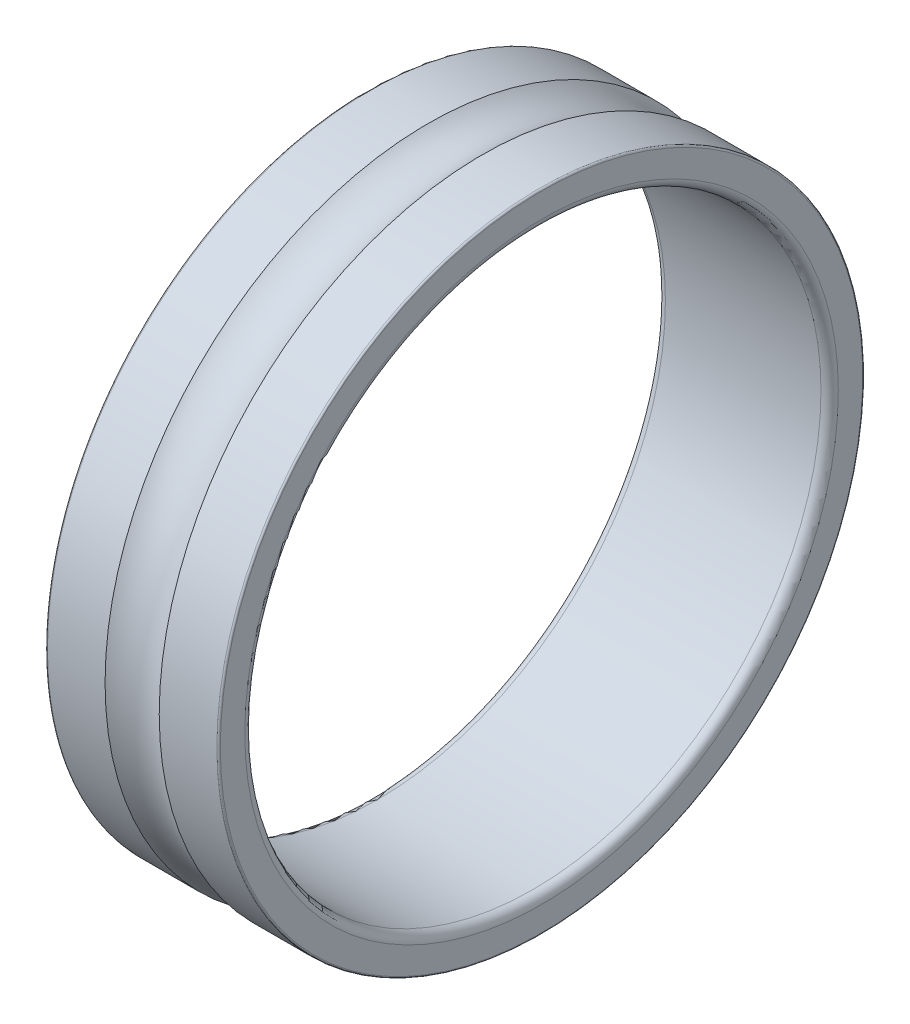
ISO-10303-21;
HEADER;
FILE_DESCRIPTION(('STEP AP214'),'2;1');
FILE_NAME('part.step','',(''),(''),'','','');
FILE_SCHEMA(('AUTOMOTIVE_DESIGN { 1 0 10303 214 1 1 1 1 }'));
ENDSEC;
DATA;
#1=APPLICATION_CONTEXT('core data for automotive mechanical design processes');
#2=APPLICATION_PROTOCOL_DEFINITION('international standard','automotive_design',2000,#1);
#3=PRODUCT_CONTEXT('',#1,'mechanical');
#4=PRODUCT('Part','Part','',(#3));
#5=PRODUCT_RELATED_PRODUCT_CATEGORY('part','',(#4));
#6=PRODUCT_DEFINITION_FORMATION('','',#4);
#7=PRODUCT_DEFINITION_CONTEXT('part definition',#1,'design');
#8=PRODUCT_DEFINITION('design','',#6,#7);
#9=PRODUCT_DEFINITION_SHAPE('','',#8);
#10=(LENGTH_UNIT() NAMED_UNIT(*) SI_UNIT(.MILLI.,.METRE.));
#11=(NAMED_UNIT(*) PLANE_ANGLE_UNIT() SI_UNIT($,.RADIAN.));
#12=(NAMED_UNIT(*) SI_UNIT($,.STERADIAN.) SOLID_ANGLE_UNIT());
#13=UNCERTAINTY_MEASURE_WITH_UNIT(LENGTH_MEASURE(1.E-05),#10,'distance_accuracy_value','');
#14=(GEOMETRIC_REPRESENTATION_CONTEXT(3) GLOBAL_UNCERTAINTY_ASSIGNED_CONTEXT((#13)) GLOBAL_UNIT_ASSIGNED_CONTEXT((#10,
#11,#12)) REPRESENTATION_CONTEXT('',''));
#15=CARTESIAN_POINT('',(0.,0.,0.));
#16=DIRECTION('',(0.,0.,1.));
#17=DIRECTION('',(1.,0.,0.));
#18=AXIS2_PLACEMENT_3D('',#15,#16,#17);
#19=CARTESIAN_POINT('',(0.,-5.575,-5.575));
#20=DIRECTION('',(-1.,0.,0.));
#21=DIRECTION('',(0.,0.,1.));
#22=AXIS2_PLACEMENT_3D('',#19,#20,#21);
#23=PLANE('',#22);
#24=CARTESIAN_POINT('',(0.,0.,0.));
#25=DIRECTION('',(-1.,0.,0.));
#26=DIRECTION('',(0.,0.,-1.));
#27=AXIS2_PLACEMENT_3D('',#24,#25,#26);
#28=CIRCLE('',#27,5.575);
#29=CARTESIAN_POINT('',(0.,0.,-5.575));
#30=VERTEX_POINT('',#29);
#31=EDGE_CURVE('E50',#30,#30,#28,.F.);
#32=ORIENTED_EDGE('',*,*,#31,.F.);
#33=EDGE_LOOP('',(#32));
#34=FACE_BOUND('',#33,.T.);
#35=CARTESIAN_POINT('',(0.,0.,0.));
#36=DIRECTION('',(1.,0.,0.));
#37=DIRECTION('',(0.,-1.4250476733921E-07,0.99999999999999));
#38=AXIS2_PLACEMENT_3D('',#35,#36,#37);
#39=CIRCLE('',#38,5.15);
#40=CARTESIAN_POINT('',(0.,-7.33899551796931E-07,5.14999999999995));
#41=VERTEX_POINT('',#40);
#42=EDGE_CURVE('E47',#41,#41,#39,.T.);
#43=ORIENTED_EDGE('',*,*,#42,.T.);
#44=EDGE_LOOP('',(#43));
#45=FACE_BOUND('',#44,.T.);
#46=ADVANCED_FACE('F15',(#34,#45),#23,.T.);
#47=CARTESIAN_POINT('',(3.,-5.575,5.575));
#48=DIRECTION('',(1.,0.,0.));
#49=DIRECTION('',(0.,0.,-1.));
#50=AXIS2_PLACEMENT_3D('',#47,#48,#49);
#51=PLANE('',#50);
#52=CARTESIAN_POINT('',(3.,0.,0.));
#53=DIRECTION('',(1.,0.,0.));
#54=DIRECTION('',(0.,0.,1.));
#55=AXIS2_PLACEMENT_3D('',#52,#53,#54);
#56=CIRCLE('',#55,5.575);
#57=CARTESIAN_POINT('',(3.,0.,5.575));
#58=VERTEX_POINT('',#57);
#59=EDGE_CURVE('E44',#58,#58,#56,.T.);
#60=ORIENTED_EDGE('',*,*,#59,.T.);
#61=EDGE_LOOP('',(#60));
#62=FACE_BOUND('',#61,.T.);
#63=CARTESIAN_POINT('',(3.,0.,0.));
#64=DIRECTION('',(-1.,0.,0.));
#65=DIRECTION('',(0.,0.,-1.));
#66=AXIS2_PLACEMENT_3D('',#63,#64,#65);
#67=CIRCLE('',#66,5.15);
#68=CARTESIAN_POINT('',(3.,0.,-5.15));
#69=VERTEX_POINT('',#68);
#70=EDGE_CURVE('E41',#69,#69,#67,.F.);
#71=ORIENTED_EDGE('',*,*,#70,.F.);
#72=EDGE_LOOP('',(#71));
#73=FACE_BOUND('',#72,.T.);
#74=ADVANCED_FACE('F59',(#62,#73),#51,.T.);
#75=CARTESIAN_POINT('',(0.0299999999999943,0.,0.));
#76=DIRECTION('',(1.,0.,0.));
#77=DIRECTION('',(0.,1.16860045008147E-09,1.));
#78=AXIS2_PLACEMENT_3D('',#75,#76,#77);
#79=TOROIDAL_SURFACE('',#78,5.575,0.0299999999999936);
#80=ORIENTED_EDGE('',*,*,#31,.T.);
#81=EDGE_LOOP('',(#80));
#82=FACE_BOUND('',#81,.T.);
#83=CARTESIAN_POINT('',(0.0299999999999942,0.,0.));
#84=DIRECTION('',(-1.,0.,0.));
#85=DIRECTION('',(0.,0.,-1.));
#86=AXIS2_PLACEMENT_3D('',#83,#84,#85);
#87=CIRCLE('',#86,5.60499999999999);
#88=CARTESIAN_POINT('',(0.0299999999999942,0.,-5.60499999999999));
#89=VERTEX_POINT('',#88);
#90=EDGE_CURVE('E38',#89,#89,#87,.F.);
#91=ORIENTED_EDGE('',*,*,#90,.F.);
#92=EDGE_LOOP('',(#91));
#93=FACE_BOUND('',#92,.T.);
#94=ADVANCED_FACE('F54',(#82,#93),#79,.T.);
#95=CARTESIAN_POINT('',(0.149999999999969,0.,0.));
#96=DIRECTION('',(1.,0.,0.));
#97=DIRECTION('',(0.,0.,1.));
#98=AXIS2_PLACEMENT_3D('',#95,#96,#97);
#99=TOROIDAL_SURFACE('',#98,5.15,0.149999999999969);
#100=CARTESIAN_POINT('',(0.149999999999997,0.,0.));
#101=DIRECTION('',(1.,0.,0.));
#102=DIRECTION('',(0.,0.,1.));
#103=AXIS2_PLACEMENT_3D('',#100,#101,#102);
#104=CIRCLE('',#103,5.00000000000003);
#105=CARTESIAN_POINT('',(0.149999999999997,0.,5.00000000000003));
#106=VERTEX_POINT('',#105);
#107=EDGE_CURVE('E35',#106,#106,#104,.T.);
#108=ORIENTED_EDGE('',*,*,#107,.T.);
#109=EDGE_LOOP('',(#108));
#110=FACE_BOUND('',#109,.T.);
#111=ORIENTED_EDGE('',*,*,#42,.F.);
#112=EDGE_LOOP('',(#111));
#113=FACE_BOUND('',#112,.T.);
#114=ADVANCED_FACE('F63',(#110,#113),#99,.T.);
#115=CARTESIAN_POINT('',(50.,0.,0.));
#116=DIRECTION('',(1.,0.,0.));
#117=DIRECTION('',(0.,0.,1.));
#118=AXIS2_PLACEMENT_3D('',#115,#116,#117);
#119=CYLINDRICAL_SURFACE('',#118,5.);
#120=CARTESIAN_POINT('',(2.85,0.,0.));
#121=DIRECTION('',(1.,0.,0.));
#122=DIRECTION('',(0.,0.,1.));
#123=AXIS2_PLACEMENT_3D('',#120,#121,#122);
#124=CIRCLE('',#123,5.);
#125=CARTESIAN_POINT('',(2.85,0.,5.));
#126=VERTEX_POINT('',#125);
#127=EDGE_CURVE('E30',#126,#126,#124,.T.);
#128=ORIENTED_EDGE('',*,*,#127,.T.);
#129=EDGE_LOOP('',(#128));
#130=FACE_BOUND('',#129,.T.);
#131=ORIENTED_EDGE('',*,*,#107,.F.);
#132=EDGE_LOOP('',(#131));
#133=FACE_BOUND('',#132,.T.);
#134=ADVANCED_FACE('F65',(#130,#133),#119,.F.);
#135=CARTESIAN_POINT('',(2.85000000000006,0.,0.));
#136=DIRECTION('',(1.,0.,0.));
#137=DIRECTION('',(0.,1.42119975022121E-07,0.99999999999999));
#138=AXIS2_PLACEMENT_3D('',#135,#136,#137);
#139=TOROIDAL_SURFACE('',#138,5.14999999999994,0.149999999999938);
#140=ORIENTED_EDGE('',*,*,#70,.T.);
#141=EDGE_LOOP('',(#140));
#142=FACE_BOUND('',#141,.T.);
#143=ORIENTED_EDGE('',*,*,#127,.F.);
#144=EDGE_LOOP('',(#143));
#145=FACE_BOUND('',#144,.T.);
#146=ADVANCED_FACE('F73',(#142,#145),#139,.T.);
#147=CARTESIAN_POINT('',(2.97,0.,0.));
#148=DIRECTION('',(1.,0.,0.));
#149=DIRECTION('',(0.,0.,1.));
#150=AXIS2_PLACEMENT_3D('',#147,#148,#149);
#151=TOROIDAL_SURFACE('',#150,5.575,0.0299999999999888);
#152=CARTESIAN_POINT('',(2.97,0.,0.));
#153=DIRECTION('',(1.,0.,0.));
#154=DIRECTION('',(0.,0.,1.));
#155=AXIS2_PLACEMENT_3D('',#152,#153,#154);
#156=CIRCLE('',#155,5.60499999999999);
#157=CARTESIAN_POINT('',(2.97,0.,5.60499999999999));
#158=VERTEX_POINT('',#157);
#159=EDGE_CURVE('E26',#158,#158,#156,.T.);
#160=ORIENTED_EDGE('',*,*,#159,.T.);
#161=EDGE_LOOP('',(#160));
#162=FACE_BOUND('',#161,.T.);
#163=ORIENTED_EDGE('',*,*,#59,.F.);
#164=EDGE_LOOP('',(#163));
#165=FACE_BOUND('',#164,.T.);
#166=ADVANCED_FACE('F81',(#162,#165),#151,.T.);
#167=CARTESIAN_POINT('',(50.,0.,0.));
#168=DIRECTION('',(1.,0.,0.));
#169=DIRECTION('',(0.,0.,1.));
#170=AXIS2_PLACEMENT_3D('',#167,#168,#169);
#171=CYLINDRICAL_SURFACE('',#170,5.605);
#172=CARTESIAN_POINT('',(1.9699319099614,0.,0.));
#173=DIRECTION('',(1.,0.,0.));
#174=DIRECTION('',(0.,0.,1.));
#175=AXIS2_PLACEMENT_3D('',#172,#173,#174);
#176=CIRCLE('',#175,5.605);
#177=CARTESIAN_POINT('',(1.9699319099614,0.,5.605));
#178=VERTEX_POINT('',#177);
#179=EDGE_CURVE('E22',#178,#178,#176,.T.);
#180=ORIENTED_EDGE('',*,*,#179,.T.);
#181=EDGE_LOOP('',(#180));
#182=FACE_BOUND('',#181,.T.);
#183=ORIENTED_EDGE('',*,*,#159,.F.);
#184=EDGE_LOOP('',(#183));
#185=FACE_BOUND('',#184,.T.);
#186=ADVANCED_FACE('F85',(#182,#185),#171,.T.);
#187=CARTESIAN_POINT('',(1.5,0.,0.));
#188=DIRECTION('',(1.,0.,0.));
#189=DIRECTION('',(0.,0.,1.));
#190=AXIS2_PLACEMENT_3D('',#187,#188,#189);
#191=TOROIDAL_SURFACE('',#190,6.2449999999999,0.793999999999899);
#192=ORIENTED_EDGE('',*,*,#179,.F.);
#193=EDGE_LOOP('',(#192));
#194=FACE_BOUND('',#193,.T.);
#195=CARTESIAN_POINT('',(1.0300680900386,0.,0.));
#196=DIRECTION('',(1.,0.,0.));
#197=DIRECTION('',(0.,0.,1.));
#198=AXIS2_PLACEMENT_3D('',#195,#196,#197);
#199=CIRCLE('',#198,5.605);
#200=CARTESIAN_POINT('',(1.0300680900386,0.,5.605));
#201=VERTEX_POINT('',#200);
#202=EDGE_CURVE('E10',#201,#201,#199,.T.);
#203=ORIENTED_EDGE('',*,*,#202,.T.);
#204=EDGE_LOOP('',(#203));
#205=FACE_BOUND('',#204,.T.);
#206=ADVANCED_FACE('F88',(#194,#205),#191,.F.);
#207=CARTESIAN_POINT('',(50.,0.,0.));
#208=DIRECTION('',(1.,0.,0.));
#209=DIRECTION('',(0.,1.9234182058889E-10,1.));
#210=AXIS2_PLACEMENT_3D('',#207,#208,#209);
#211=CYLINDRICAL_SURFACE('',#210,5.605);
#212=ORIENTED_EDGE('',*,*,#90,.T.);
#213=EDGE_LOOP('',(#212));
#214=FACE_BOUND('',#213,.T.);
#215=ORIENTED_EDGE('',*,*,#202,.F.);
#216=EDGE_LOOP('',(#215));
#217=FACE_BOUND('',#216,.T.);
#218=ADVANCED_FACE('F17',(#214,#217),#211,.T.);
#219=CLOSED_SHELL('',(#46,#74,#94,#114,#134,#146,#166,#186,#206,#218));
#220=MANIFOLD_SOLID_BREP('B1',#219);
#221=ADVANCED_BREP_SHAPE_REPRESENTATION('',(#18,#220),#14);
#222=SHAPE_DEFINITION_REPRESENTATION(#9,#221);
ENDSEC;
END-ISO-10303-21;
